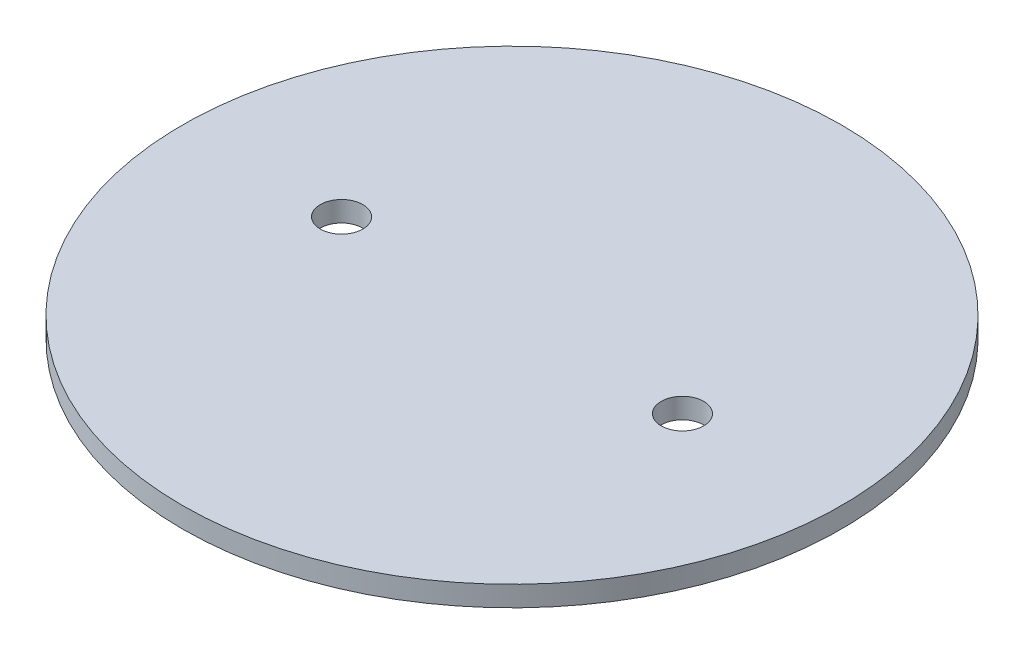
ISO-10303-21;
HEADER;
FILE_DESCRIPTION(('STEP AP214'),'2;1');
FILE_NAME('part.step','',(''),(''),'','','');
FILE_SCHEMA(('AUTOMOTIVE_DESIGN { 1 0 10303 214 1 1 1 1 }'));
ENDSEC;
DATA;
#1=APPLICATION_CONTEXT('core data for automotive mechanical design processes');
#2=APPLICATION_PROTOCOL_DEFINITION('international standard','automotive_design',2000,#1);
#3=PRODUCT_CONTEXT('',#1,'mechanical');
#4=PRODUCT('Part','Part','',(#3));
#5=PRODUCT_RELATED_PRODUCT_CATEGORY('part','',(#4));
#6=PRODUCT_DEFINITION_FORMATION('','',#4);
#7=PRODUCT_DEFINITION_CONTEXT('part definition',#1,'design');
#8=PRODUCT_DEFINITION('design','',#6,#7);
#9=PRODUCT_DEFINITION_SHAPE('','',#8);
#10=(LENGTH_UNIT() NAMED_UNIT(*) SI_UNIT(.MILLI.,.METRE.));
#11=(NAMED_UNIT(*) PLANE_ANGLE_UNIT() SI_UNIT($,.RADIAN.));
#12=(NAMED_UNIT(*) SI_UNIT($,.STERADIAN.) SOLID_ANGLE_UNIT());
#13=UNCERTAINTY_MEASURE_WITH_UNIT(LENGTH_MEASURE(1.E-05),#10,'distance_accuracy_value','');
#14=(GEOMETRIC_REPRESENTATION_CONTEXT(3) GLOBAL_UNCERTAINTY_ASSIGNED_CONTEXT((#13)) GLOBAL_UNIT_ASSIGNED_CONTEXT((#10,
#11,#12)) REPRESENTATION_CONTEXT('',''));
#15=CARTESIAN_POINT('',(0.,0.,0.));
#16=DIRECTION('',(0.,0.,1.));
#17=DIRECTION('',(1.,0.,0.));
#18=AXIS2_PLACEMENT_3D('',#15,#16,#17);
#19=CARTESIAN_POINT('',(0.,3.,0.));
#20=DIRECTION('',(0.,1.,0.));
#21=DIRECTION('',(0.,0.,1.));
#22=AXIS2_PLACEMENT_3D('',#19,#20,#21);
#23=PLANE('',#22);
#24=CARTESIAN_POINT('',(50.115,3.,0.));
#25=DIRECTION('',(0.,1.,0.));
#26=DIRECTION('',(0.,0.,1.));
#27=AXIS2_PLACEMENT_3D('',#24,#25,#26);
#28=CIRCLE('',#27,6.25);
#29=CARTESIAN_POINT('',(50.115,3.,6.25));
#30=VERTEX_POINT('',#29);
#31=EDGE_CURVE('E54',#30,#30,#28,.T.);
#32=ORIENTED_EDGE('',*,*,#31,.F.);
#33=EDGE_LOOP('',(#32));
#34=FACE_BOUND('',#33,.T.);
#35=CARTESIAN_POINT('',(0.,3.,0.));
#36=DIRECTION('',(0.,1.,0.));
#37=DIRECTION('',(0.,0.,1.));
#38=AXIS2_PLACEMENT_3D('',#35,#36,#37);
#39=CIRCLE('',#38,96.9);
#40=CARTESIAN_POINT('',(0.,3.,96.9));
#41=VERTEX_POINT('',#40);
#42=EDGE_CURVE('E10',#41,#41,#39,.T.);
#43=ORIENTED_EDGE('',*,*,#42,.T.);
#44=EDGE_LOOP('',(#43));
#45=FACE_BOUND('',#44,.T.);
#46=CARTESIAN_POINT('',(-50.115,3.,0.));
#47=DIRECTION('',(0.,1.,0.));
#48=DIRECTION('',(0.,0.,-1.));
#49=AXIS2_PLACEMENT_3D('',#46,#47,#48);
#50=CIRCLE('',#49,6.25);
#51=CARTESIAN_POINT('',(-50.115,3.,-6.25));
#52=VERTEX_POINT('',#51);
#53=EDGE_CURVE('E60',#52,#52,#50,.T.);
#54=ORIENTED_EDGE('',*,*,#53,.F.);
#55=EDGE_LOOP('',(#54));
#56=FACE_BOUND('',#55,.T.);
#57=ADVANCED_FACE('F41',(#34,#45,#56),#23,.T.);
#58=CARTESIAN_POINT('',(0.,-3.,0.));
#59=DIRECTION('',(0.,1.,0.));
#60=DIRECTION('',(0.,0.,1.));
#61=AXIS2_PLACEMENT_3D('',#58,#59,#60);
#62=PLANE('',#61);
#63=CARTESIAN_POINT('',(0.,-3.,0.));
#64=DIRECTION('',(0.,1.,0.));
#65=DIRECTION('',(0.,0.,1.));
#66=AXIS2_PLACEMENT_3D('',#63,#64,#65);
#67=CIRCLE('',#66,96.9);
#68=CARTESIAN_POINT('',(0.,-3.,96.9));
#69=VERTEX_POINT('',#68);
#70=EDGE_CURVE('E45',#69,#69,#67,.T.);
#71=ORIENTED_EDGE('',*,*,#70,.F.);
#72=EDGE_LOOP('',(#71));
#73=FACE_BOUND('',#72,.T.);
#74=CARTESIAN_POINT('',(50.115,-3.,0.));
#75=DIRECTION('',(0.,1.,0.));
#76=DIRECTION('',(0.,0.,1.));
#77=AXIS2_PLACEMENT_3D('',#74,#75,#76);
#78=CIRCLE('',#77,6.25);
#79=CARTESIAN_POINT('',(50.115,-3.,6.25));
#80=VERTEX_POINT('',#79);
#81=EDGE_CURVE('E56',#80,#80,#78,.T.);
#82=ORIENTED_EDGE('',*,*,#81,.T.);
#83=EDGE_LOOP('',(#82));
#84=FACE_BOUND('',#83,.T.);
#85=CARTESIAN_POINT('',(-50.115,-3.,0.));
#86=DIRECTION('',(0.,1.,0.));
#87=DIRECTION('',(0.,0.,-1.));
#88=AXIS2_PLACEMENT_3D('',#85,#86,#87);
#89=CIRCLE('',#88,6.25);
#90=CARTESIAN_POINT('',(-50.115,-3.,-6.25));
#91=VERTEX_POINT('',#90);
#92=EDGE_CURVE('E64',#91,#91,#89,.T.);
#93=ORIENTED_EDGE('',*,*,#92,.T.);
#94=EDGE_LOOP('',(#93));
#95=FACE_BOUND('',#94,.T.);
#96=ADVANCED_FACE('F76',(#73,#84,#95),#62,.F.);
#97=CARTESIAN_POINT('',(0.,3.,0.));
#98=DIRECTION('',(0.,-1.,0.));
#99=DIRECTION('',(0.,0.,-1.));
#100=AXIS2_PLACEMENT_3D('',#97,#98,#99);
#101=CYLINDRICAL_SURFACE('',#100,96.9);
#102=ORIENTED_EDGE('',*,*,#42,.F.);
#103=EDGE_LOOP('',(#102));
#104=FACE_BOUND('',#103,.T.);
#105=ORIENTED_EDGE('',*,*,#70,.T.);
#106=EDGE_LOOP('',(#105));
#107=FACE_BOUND('',#106,.T.);
#108=ADVANCED_FACE('F43',(#104,#107),#101,.T.);
#109=CARTESIAN_POINT('',(50.115,3.,0.));
#110=DIRECTION('',(0.,-1.,0.));
#111=DIRECTION('',(0.,0.,-1.));
#112=AXIS2_PLACEMENT_3D('',#109,#110,#111);
#113=CYLINDRICAL_SURFACE('',#112,6.25);
#114=ORIENTED_EDGE('',*,*,#31,.T.);
#115=EDGE_LOOP('',(#114));
#116=FACE_BOUND('',#115,.T.);
#117=ORIENTED_EDGE('',*,*,#81,.F.);
#118=EDGE_LOOP('',(#117));
#119=FACE_BOUND('',#118,.T.);
#120=ADVANCED_FACE('F85',(#116,#119),#113,.F.);
#121=CARTESIAN_POINT('',(-50.115,3.,0.));
#122=DIRECTION('',(0.,-1.,0.));
#123=DIRECTION('',(0.,0.,-1.));
#124=AXIS2_PLACEMENT_3D('',#121,#122,#123);
#125=CYLINDRICAL_SURFACE('',#124,6.25);
#126=ORIENTED_EDGE('',*,*,#53,.T.);
#127=EDGE_LOOP('',(#126));
#128=FACE_BOUND('',#127,.T.);
#129=ORIENTED_EDGE('',*,*,#92,.F.);
#130=EDGE_LOOP('',(#129));
#131=FACE_BOUND('',#130,.T.);
#132=ADVANCED_FACE('F72',(#128,#131),#125,.F.);
#133=CLOSED_SHELL('',(#57,#96,#108,#120,#132));
#134=MANIFOLD_SOLID_BREP('B2',#133);
#135=ADVANCED_BREP_SHAPE_REPRESENTATION('',(#18,#134),#14);
#136=SHAPE_DEFINITION_REPRESENTATION(#9,#135);
ENDSEC;
END-ISO-10303-21;
